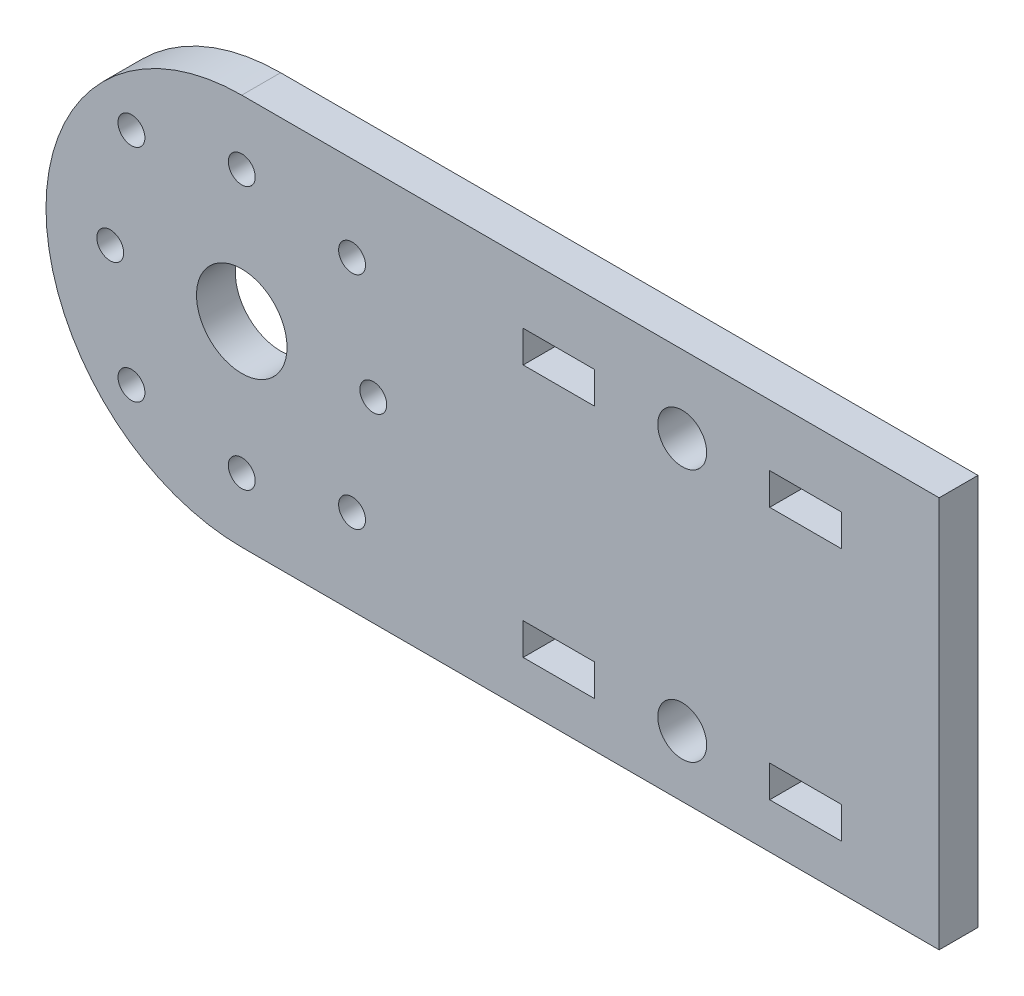
ISO-10303-21;
HEADER;
FILE_DESCRIPTION(('STEP AP214'),'2;1');
FILE_NAME('part.step','',(''),(''),'','','');
FILE_SCHEMA(('AUTOMOTIVE_DESIGN { 1 0 10303 214 1 1 1 1 }'));
ENDSEC;
DATA;
#1=APPLICATION_CONTEXT('core data for automotive mechanical design processes');
#2=APPLICATION_PROTOCOL_DEFINITION('international standard','automotive_design',2000,#1);
#3=PRODUCT_CONTEXT('',#1,'mechanical');
#4=PRODUCT('Part','Part','',(#3));
#5=PRODUCT_RELATED_PRODUCT_CATEGORY('part','',(#4));
#6=PRODUCT_DEFINITION_FORMATION('','',#4);
#7=PRODUCT_DEFINITION_CONTEXT('part definition',#1,'design');
#8=PRODUCT_DEFINITION('design','',#6,#7);
#9=PRODUCT_DEFINITION_SHAPE('','',#8);
#10=(LENGTH_UNIT() NAMED_UNIT(*) SI_UNIT(.MILLI.,.METRE.));
#11=(NAMED_UNIT(*) PLANE_ANGLE_UNIT() SI_UNIT($,.RADIAN.));
#12=(NAMED_UNIT(*) SI_UNIT($,.STERADIAN.) SOLID_ANGLE_UNIT());
#13=UNCERTAINTY_MEASURE_WITH_UNIT(LENGTH_MEASURE(1.E-05),#10,'distance_accuracy_value','');
#14=(GEOMETRIC_REPRESENTATION_CONTEXT(3) GLOBAL_UNCERTAINTY_ASSIGNED_CONTEXT((#13)) GLOBAL_UNIT_ASSIGNED_CONTEXT((#10,
#11,#12)) REPRESENTATION_CONTEXT('',''));
#15=CARTESIAN_POINT('',(0.,0.,0.));
#16=DIRECTION('',(0.,0.,1.));
#17=DIRECTION('',(1.,0.,0.));
#18=AXIS2_PLACEMENT_3D('',#15,#16,#17);
#19=CARTESIAN_POINT('',(19.,16.,3.175));
#20=DIRECTION('',(0.,0.,1.));
#21=DIRECTION('',(1.,0.,0.));
#22=AXIS2_PLACEMENT_3D('',#19,#20,#21);
#23=PLANE('',#22);
#24=DIRECTION('',(1.,0.,0.));
#25=VECTOR('',#24,1.);
#26=CARTESIAN_POINT('',(62.15,24.4,3.175));
#27=LINE('',#26,#25);
#28=CARTESIAN_POINT('',(62.15,24.4,3.175));
#29=VERTEX_POINT('',#28);
#30=CARTESIAN_POINT('',(68.,24.4,3.175));
#31=VERTEX_POINT('',#30);
#32=EDGE_CURVE('E178',#29,#31,#27,.T.);
#33=ORIENTED_EDGE('',*,*,#32,.F.);
#34=DIRECTION('',(0.,-1.,0.));
#35=VECTOR('',#34,1.);
#36=CARTESIAN_POINT('',(62.15,27.,3.175));
#37=LINE('',#36,#35);
#38=CARTESIAN_POINT('',(62.15,27.,3.175));
#39=VERTEX_POINT('',#38);
#40=EDGE_CURVE('E170',#39,#29,#37,.T.);
#41=ORIENTED_EDGE('',*,*,#40,.F.);
#42=DIRECTION('',(-1.,0.,0.));
#43=VECTOR('',#42,1.);
#44=CARTESIAN_POINT('',(62.15,27.,3.175));
#45=LINE('',#44,#43);
#46=CARTESIAN_POINT('',(68.,27.,3.175));
#47=VERTEX_POINT('',#46);
#48=EDGE_CURVE('E193',#47,#39,#45,.T.);
#49=ORIENTED_EDGE('',*,*,#48,.F.);
#50=DIRECTION('',(0.,1.,0.));
#51=VECTOR('',#50,1.);
#52=CARTESIAN_POINT('',(68.,27.,3.175));
#53=LINE('',#52,#51);
#54=EDGE_CURVE('E191',#31,#47,#53,.T.);
#55=ORIENTED_EDGE('',*,*,#54,.F.);
#56=EDGE_LOOP('',(#33,#41,#49,#55));
#57=FACE_BOUND('',#56,.T.);
#58=DIRECTION('',(-1.,0.,0.));
#59=VECTOR('',#58,1.);
#60=CARTESIAN_POINT('',(47.85,6.3,3.175));
#61=LINE('',#60,#59);
#62=CARTESIAN_POINT('',(47.85,6.3,3.175));
#63=VERTEX_POINT('',#62);
#64=CARTESIAN_POINT('',(42.,6.3,3.175));
#65=VERTEX_POINT('',#64);
#66=EDGE_CURVE('E242',#63,#65,#61,.T.);
#67=ORIENTED_EDGE('',*,*,#66,.F.);
#68=DIRECTION('',(0.,1.,0.));
#69=VECTOR('',#68,1.);
#70=CARTESIAN_POINT('',(47.85,6.3,3.175));
#71=LINE('',#70,#69);
#72=CARTESIAN_POINT('',(47.85,3.7,3.175));
#73=VERTEX_POINT('',#72);
#74=EDGE_CURVE('E240',#73,#63,#71,.T.);
#75=ORIENTED_EDGE('',*,*,#74,.F.);
#76=DIRECTION('',(1.,0.,0.));
#77=VECTOR('',#76,1.);
#78=CARTESIAN_POINT('',(47.85,3.7,3.175));
#79=LINE('',#78,#77);
#80=CARTESIAN_POINT('',(42.,3.7,3.175));
#81=VERTEX_POINT('',#80);
#82=EDGE_CURVE('E248',#81,#73,#79,.T.);
#83=ORIENTED_EDGE('',*,*,#82,.F.);
#84=DIRECTION('',(0.,-1.,0.));
#85=VECTOR('',#84,1.);
#86=CARTESIAN_POINT('',(42.,6.3,3.175));
#87=LINE('',#86,#85);
#88=EDGE_CURVE('E245',#65,#81,#87,.T.);
#89=ORIENTED_EDGE('',*,*,#88,.F.);
#90=EDGE_LOOP('',(#67,#75,#83,#89));
#91=FACE_BOUND('',#90,.T.);
#92=DIRECTION('',(1.,0.,0.));
#93=VECTOR('',#92,1.);
#94=CARTESIAN_POINT('',(42.,24.4,3.175));
#95=LINE('',#94,#93);
#96=CARTESIAN_POINT('',(42.,24.4,3.175));
#97=VERTEX_POINT('',#96);
#98=CARTESIAN_POINT('',(47.85,24.4,3.175));
#99=VERTEX_POINT('',#98);
#100=EDGE_CURVE('E279',#97,#99,#95,.T.);
#101=ORIENTED_EDGE('',*,*,#100,.F.);
#102=DIRECTION('',(0.,-1.,0.));
#103=VECTOR('',#102,1.);
#104=CARTESIAN_POINT('',(42.,27.,3.175));
#105=LINE('',#104,#103);
#106=CARTESIAN_POINT('',(42.,27.,3.175));
#107=VERTEX_POINT('',#106);
#108=EDGE_CURVE('E277',#107,#97,#105,.T.);
#109=ORIENTED_EDGE('',*,*,#108,.F.);
#110=DIRECTION('',(-1.,0.,0.));
#111=VECTOR('',#110,1.);
#112=CARTESIAN_POINT('',(42.,27.,3.175));
#113=LINE('',#112,#111);
#114=CARTESIAN_POINT('',(47.85,27.,3.175));
#115=VERTEX_POINT('',#114);
#116=EDGE_CURVE('E285',#115,#107,#113,.T.);
#117=ORIENTED_EDGE('',*,*,#116,.F.);
#118=DIRECTION('',(0.,1.,0.));
#119=VECTOR('',#118,1.);
#120=CARTESIAN_POINT('',(47.85,27.,3.175));
#121=LINE('',#120,#119);
#122=EDGE_CURVE('E282',#99,#115,#121,.T.);
#123=ORIENTED_EDGE('',*,*,#122,.F.);
#124=EDGE_LOOP('',(#101,#109,#117,#123));
#125=FACE_BOUND('',#124,.T.);
#126=CARTESIAN_POINT('',(29.75,16.,3.175));
#127=DIRECTION('',(0.,0.,1.));
#128=DIRECTION('',(1.,0.,0.));
#129=AXIS2_PLACEMENT_3D('',#126,#127,#128);
#130=CIRCLE('',#129,1.1);
#131=CARTESIAN_POINT('',(30.85,16.,3.175));
#132=VERTEX_POINT('',#131);
#133=EDGE_CURVE('E314',#132,#132,#130,.T.);
#134=ORIENTED_EDGE('',*,*,#133,.F.);
#135=EDGE_LOOP('',(#134));
#136=FACE_BOUND('',#135,.T.);
#137=CARTESIAN_POINT('',(9.98438853987172,6.98438853987153,3.175));
#138=DIRECTION('',(0.,0.,1.));
#139=DIRECTION('',(1.,0.,0.));
#140=AXIS2_PLACEMENT_3D('',#137,#138,#139);
#141=CIRCLE('',#140,1.1);
#142=CARTESIAN_POINT('',(11.0843885398717,6.98438853987153,3.175));
#143=VERTEX_POINT('',#142);
#144=EDGE_CURVE('E326',#143,#143,#141,.T.);
#145=ORIENTED_EDGE('',*,*,#144,.F.);
#146=EDGE_LOOP('',(#145));
#147=FACE_BOUND('',#146,.T.);
#148=CARTESIAN_POINT('',(28.0156114601285,25.0156114601287,3.175));
#149=DIRECTION('',(0.,0.,1.));
#150=DIRECTION('',(1.,0.,0.));
#151=AXIS2_PLACEMENT_3D('',#148,#149,#150);
#152=CIRCLE('',#151,1.1);
#153=CARTESIAN_POINT('',(29.1156114601285,25.0156114601287,3.175));
#154=VERTEX_POINT('',#153);
#155=EDGE_CURVE('E338',#154,#154,#152,.T.);
#156=ORIENTED_EDGE('',*,*,#155,.F.);
#157=EDGE_LOOP('',(#156));
#158=FACE_BOUND('',#157,.T.);
#159=CARTESIAN_POINT('',(9.98438853987153,25.0156114601285,3.175));
#160=DIRECTION('',(0.,0.,1.));
#161=DIRECTION('',(1.,0.,0.));
#162=AXIS2_PLACEMENT_3D('',#159,#160,#161);
#163=CIRCLE('',#162,1.1);
#164=CARTESIAN_POINT('',(11.0843885398715,25.0156114601285,3.175));
#165=VERTEX_POINT('',#164);
#166=EDGE_CURVE('E350',#165,#165,#163,.T.);
#167=ORIENTED_EDGE('',*,*,#166,.F.);
#168=EDGE_LOOP('',(#167));
#169=FACE_BOUND('',#168,.T.);
#170=DIRECTION('',(0.,1.,0.));
#171=VECTOR('',#170,1.);
#172=CARTESIAN_POINT('',(76.,0.,3.175));
#173=LINE('',#172,#171);
#174=CARTESIAN_POINT('',(76.,0.,3.175));
#175=VERTEX_POINT('',#174);
#176=CARTESIAN_POINT('',(76.,32.,3.175));
#177=VERTEX_POINT('',#176);
#178=EDGE_CURVE('E362',#175,#177,#173,.T.);
#179=ORIENTED_EDGE('',*,*,#178,.T.);
#180=DIRECTION('',(-1.,0.,0.));
#181=VECTOR('',#180,1.);
#182=CARTESIAN_POINT('',(19.,32.,3.175));
#183=LINE('',#182,#181);
#184=CARTESIAN_POINT('',(19.,32.,3.175));
#185=VERTEX_POINT('',#184);
#186=EDGE_CURVE('E365',#177,#185,#183,.T.);
#187=ORIENTED_EDGE('',*,*,#186,.T.);
#188=CARTESIAN_POINT('',(19.,16.,3.175));
#189=DIRECTION('',(0.,0.,1.));
#190=DIRECTION('',(1.,0.,0.));
#191=AXIS2_PLACEMENT_3D('',#188,#189,#190);
#192=CIRCLE('',#191,16.);
#193=CARTESIAN_POINT('',(19.,0.,3.175));
#194=VERTEX_POINT('',#193);
#195=EDGE_CURVE('E368',#185,#194,#192,.T.);
#196=ORIENTED_EDGE('',*,*,#195,.T.);
#197=DIRECTION('',(1.,0.,0.));
#198=VECTOR('',#197,1.);
#199=CARTESIAN_POINT('',(19.,0.,3.175));
#200=LINE('',#199,#198);
#201=EDGE_CURVE('E370',#194,#175,#200,.T.);
#202=ORIENTED_EDGE('',*,*,#201,.T.);
#203=EDGE_LOOP('',(#179,#187,#196,#202));
#204=FACE_BOUND('',#203,.T.);
#205=CARTESIAN_POINT('',(8.25,16.,3.175));
#206=DIRECTION('',(0.,0.,1.));
#207=DIRECTION('',(1.,0.,0.));
#208=AXIS2_PLACEMENT_3D('',#205,#206,#207);
#209=CIRCLE('',#208,1.1);
#210=CARTESIAN_POINT('',(9.35,16.,3.175));
#211=VERTEX_POINT('',#210);
#212=EDGE_CURVE('E356',#211,#211,#209,.T.);
#213=ORIENTED_EDGE('',*,*,#212,.F.);
#214=EDGE_LOOP('',(#213));
#215=FACE_BOUND('',#214,.T.);
#216=CARTESIAN_POINT('',(19.,16.,3.175));
#217=DIRECTION('',(0.,0.,1.));
#218=DIRECTION('',(1.,0.,0.));
#219=AXIS2_PLACEMENT_3D('',#216,#217,#218);
#220=CIRCLE('',#219,3.7);
#221=CARTESIAN_POINT('',(22.7,16.,3.175));
#222=VERTEX_POINT('',#221);
#223=EDGE_CURVE('E344',#222,#222,#220,.T.);
#224=ORIENTED_EDGE('',*,*,#223,.F.);
#225=EDGE_LOOP('',(#224));
#226=FACE_BOUND('',#225,.T.);
#227=CARTESIAN_POINT('',(28.0156114601287,6.98438853987172,3.175));
#228=DIRECTION('',(0.,0.,1.));
#229=DIRECTION('',(1.,0.,0.));
#230=AXIS2_PLACEMENT_3D('',#227,#228,#229);
#231=CIRCLE('',#230,1.1);
#232=CARTESIAN_POINT('',(29.1156114601287,6.98438853987172,3.175));
#233=VERTEX_POINT('',#232);
#234=EDGE_CURVE('E332',#233,#233,#231,.T.);
#235=ORIENTED_EDGE('',*,*,#234,.F.);
#236=EDGE_LOOP('',(#235));
#237=FACE_BOUND('',#236,.T.);
#238=CARTESIAN_POINT('',(19.,26.75,3.175));
#239=DIRECTION('',(0.,0.,1.));
#240=DIRECTION('',(1.,0.,0.));
#241=AXIS2_PLACEMENT_3D('',#238,#239,#240);
#242=CIRCLE('',#241,1.1);
#243=CARTESIAN_POINT('',(20.1,26.75,3.175));
#244=VERTEX_POINT('',#243);
#245=EDGE_CURVE('E320',#244,#244,#242,.T.);
#246=ORIENTED_EDGE('',*,*,#245,.F.);
#247=EDGE_LOOP('',(#246));
#248=FACE_BOUND('',#247,.T.);
#249=CARTESIAN_POINT('',(19.,5.25,3.175));
#250=DIRECTION('',(0.,0.,1.));
#251=DIRECTION('',(1.,0.,0.));
#252=AXIS2_PLACEMENT_3D('',#249,#250,#251);
#253=CIRCLE('',#252,1.1);
#254=CARTESIAN_POINT('',(20.1,5.25,3.175));
#255=VERTEX_POINT('',#254);
#256=EDGE_CURVE('E308',#255,#255,#253,.T.);
#257=ORIENTED_EDGE('',*,*,#256,.F.);
#258=EDGE_LOOP('',(#257));
#259=FACE_BOUND('',#258,.T.);
#260=CARTESIAN_POINT('',(55.,5.,3.175));
#261=DIRECTION('',(0.,0.,1.));
#262=DIRECTION('',(1.,0.,0.));
#263=AXIS2_PLACEMENT_3D('',#260,#261,#262);
#264=CIRCLE('',#263,2.);
#265=CARTESIAN_POINT('',(57.,5.,3.175));
#266=VERTEX_POINT('',#265);
#267=EDGE_CURVE('E271',#266,#266,#264,.T.);
#268=ORIENTED_EDGE('',*,*,#267,.F.);
#269=EDGE_LOOP('',(#268));
#270=FACE_BOUND('',#269,.T.);
#271=DIRECTION('',(1.,0.,0.));
#272=VECTOR('',#271,1.);
#273=CARTESIAN_POINT('',(62.15,3.7,3.175));
#274=LINE('',#273,#272);
#275=CARTESIAN_POINT('',(62.15,3.7,3.175));
#276=VERTEX_POINT('',#275);
#277=CARTESIAN_POINT('',(68.,3.7,3.175));
#278=VERTEX_POINT('',#277);
#279=EDGE_CURVE('E211',#276,#278,#274,.T.);
#280=ORIENTED_EDGE('',*,*,#279,.F.);
#281=DIRECTION('',(0.,-1.,0.));
#282=VECTOR('',#281,1.);
#283=CARTESIAN_POINT('',(62.15,6.3,3.175));
#284=LINE('',#283,#282);
#285=CARTESIAN_POINT('',(62.15,6.3,3.175));
#286=VERTEX_POINT('',#285);
#287=EDGE_CURVE('E209',#286,#276,#284,.T.);
#288=ORIENTED_EDGE('',*,*,#287,.F.);
#289=DIRECTION('',(-1.,0.,0.));
#290=VECTOR('',#289,1.);
#291=CARTESIAN_POINT('',(62.15,6.3,3.175));
#292=LINE('',#291,#290);
#293=CARTESIAN_POINT('',(68.,6.3,3.175));
#294=VERTEX_POINT('',#293);
#295=EDGE_CURVE('E217',#294,#286,#292,.T.);
#296=ORIENTED_EDGE('',*,*,#295,.F.);
#297=DIRECTION('',(0.,1.,0.));
#298=VECTOR('',#297,1.);
#299=CARTESIAN_POINT('',(68.,6.3,3.175));
#300=LINE('',#299,#298);
#301=EDGE_CURVE('E214',#278,#294,#300,.T.);
#302=ORIENTED_EDGE('',*,*,#301,.F.);
#303=EDGE_LOOP('',(#280,#288,#296,#302));
#304=FACE_BOUND('',#303,.T.);
#305=CARTESIAN_POINT('',(55.,25.7,3.175));
#306=DIRECTION('',(0.,0.,1.));
#307=DIRECTION('',(1.,0.,0.));
#308=AXIS2_PLACEMENT_3D('',#305,#306,#307);
#309=CIRCLE('',#308,2.);
#310=CARTESIAN_POINT('',(57.,25.7,3.175));
#311=VERTEX_POINT('',#310);
#312=EDGE_CURVE('E199',#311,#311,#309,.T.);
#313=ORIENTED_EDGE('',*,*,#312,.F.);
#314=EDGE_LOOP('',(#313));
#315=FACE_BOUND('',#314,.T.);
#316=ADVANCED_FACE('F33',(#57,#91,#125,#136,#147,#158,#169,#204,#215,#226,#237,#248,#259,#270,
#304,#315),#23,.T.);
#317=CARTESIAN_POINT('',(19.,16.,0.));
#318=DIRECTION('',(0.,0.,1.));
#319=DIRECTION('',(1.,0.,0.));
#320=AXIS2_PLACEMENT_3D('',#317,#318,#319);
#321=PLANE('',#320);
#322=DIRECTION('',(0.,-1.,0.));
#323=VECTOR('',#322,1.);
#324=CARTESIAN_POINT('',(62.15,27.,0.));
#325=LINE('',#324,#323);
#326=CARTESIAN_POINT('',(62.15,27.,0.));
#327=VERTEX_POINT('',#326);
#328=CARTESIAN_POINT('',(62.15,24.4,0.));
#329=VERTEX_POINT('',#328);
#330=EDGE_CURVE('E56',#327,#329,#325,.T.);
#331=ORIENTED_EDGE('',*,*,#330,.T.);
#332=DIRECTION('',(1.,0.,0.));
#333=VECTOR('',#332,1.);
#334=CARTESIAN_POINT('',(62.15,24.4,0.));
#335=LINE('',#334,#333);
#336=CARTESIAN_POINT('',(68.,24.4,0.));
#337=VERTEX_POINT('',#336);
#338=EDGE_CURVE('E185',#329,#337,#335,.T.);
#339=ORIENTED_EDGE('',*,*,#338,.T.);
#340=DIRECTION('',(0.,1.,0.));
#341=VECTOR('',#340,1.);
#342=CARTESIAN_POINT('',(68.,27.,0.));
#343=LINE('',#342,#341);
#344=CARTESIAN_POINT('',(68.,27.,0.));
#345=VERTEX_POINT('',#344);
#346=EDGE_CURVE('E201',#337,#345,#343,.T.);
#347=ORIENTED_EDGE('',*,*,#346,.T.);
#348=DIRECTION('',(-1.,0.,0.));
#349=VECTOR('',#348,1.);
#350=CARTESIAN_POINT('',(62.15,27.,0.));
#351=LINE('',#350,#349);
#352=EDGE_CURVE('E179',#345,#327,#351,.T.);
#353=ORIENTED_EDGE('',*,*,#352,.T.);
#354=EDGE_LOOP('',(#331,#339,#347,#353));
#355=FACE_BOUND('',#354,.T.);
#356=DIRECTION('',(0.,1.,0.));
#357=VECTOR('',#356,1.);
#358=CARTESIAN_POINT('',(47.85,6.3,0.));
#359=LINE('',#358,#357);
#360=CARTESIAN_POINT('',(47.85,3.7,0.));
#361=VERTEX_POINT('',#360);
#362=CARTESIAN_POINT('',(47.85,6.3,0.));
#363=VERTEX_POINT('',#362);
#364=EDGE_CURVE('E239',#361,#363,#359,.T.);
#365=ORIENTED_EDGE('',*,*,#364,.T.);
#366=DIRECTION('',(-1.,0.,0.));
#367=VECTOR('',#366,1.);
#368=CARTESIAN_POINT('',(47.85,6.3,0.));
#369=LINE('',#368,#367);
#370=CARTESIAN_POINT('',(42.,6.3,0.));
#371=VERTEX_POINT('',#370);
#372=EDGE_CURVE('E253',#363,#371,#369,.T.);
#373=ORIENTED_EDGE('',*,*,#372,.T.);
#374=DIRECTION('',(0.,-1.,0.));
#375=VECTOR('',#374,1.);
#376=CARTESIAN_POINT('',(42.,6.3,0.));
#377=LINE('',#376,#375);
#378=CARTESIAN_POINT('',(42.,3.7,0.));
#379=VERTEX_POINT('',#378);
#380=EDGE_CURVE('E256',#371,#379,#377,.T.);
#381=ORIENTED_EDGE('',*,*,#380,.T.);
#382=DIRECTION('',(1.,0.,0.));
#383=VECTOR('',#382,1.);
#384=CARTESIAN_POINT('',(47.85,3.7,0.));
#385=LINE('',#384,#383);
#386=EDGE_CURVE('E243',#379,#361,#385,.T.);
#387=ORIENTED_EDGE('',*,*,#386,.T.);
#388=EDGE_LOOP('',(#365,#373,#381,#387));
#389=FACE_BOUND('',#388,.T.);
#390=DIRECTION('',(0.,-1.,0.));
#391=VECTOR('',#390,1.);
#392=CARTESIAN_POINT('',(42.,27.,0.));
#393=LINE('',#392,#391);
#394=CARTESIAN_POINT('',(42.,27.,0.));
#395=VERTEX_POINT('',#394);
#396=CARTESIAN_POINT('',(42.,24.4,0.));
#397=VERTEX_POINT('',#396);
#398=EDGE_CURVE('E274',#395,#397,#393,.T.);
#399=ORIENTED_EDGE('',*,*,#398,.T.);
#400=DIRECTION('',(1.,0.,0.));
#401=VECTOR('',#400,1.);
#402=CARTESIAN_POINT('',(42.,24.4,0.));
#403=LINE('',#402,#401);
#404=CARTESIAN_POINT('',(47.85,24.4,0.));
#405=VERTEX_POINT('',#404);
#406=EDGE_CURVE('E290',#397,#405,#403,.T.);
#407=ORIENTED_EDGE('',*,*,#406,.T.);
#408=DIRECTION('',(0.,1.,0.));
#409=VECTOR('',#408,1.);
#410=CARTESIAN_POINT('',(47.85,27.,0.));
#411=LINE('',#410,#409);
#412=CARTESIAN_POINT('',(47.85,27.,0.));
#413=VERTEX_POINT('',#412);
#414=EDGE_CURVE('E293',#405,#413,#411,.T.);
#415=ORIENTED_EDGE('',*,*,#414,.T.);
#416=DIRECTION('',(-1.,0.,0.));
#417=VECTOR('',#416,1.);
#418=CARTESIAN_POINT('',(42.,27.,0.));
#419=LINE('',#418,#417);
#420=EDGE_CURVE('E280',#413,#395,#419,.T.);
#421=ORIENTED_EDGE('',*,*,#420,.T.);
#422=EDGE_LOOP('',(#399,#407,#415,#421));
#423=FACE_BOUND('',#422,.T.);
#424=CARTESIAN_POINT('',(29.75,16.,0.));
#425=DIRECTION('',(0.,0.,1.));
#426=DIRECTION('',(1.,0.,0.));
#427=AXIS2_PLACEMENT_3D('',#424,#425,#426);
#428=CIRCLE('',#427,1.1);
#429=CARTESIAN_POINT('',(30.85,16.,0.));
#430=VERTEX_POINT('',#429);
#431=EDGE_CURVE('E311',#430,#430,#428,.T.);
#432=ORIENTED_EDGE('',*,*,#431,.T.);
#433=EDGE_LOOP('',(#432));
#434=FACE_BOUND('',#433,.T.);
#435=CARTESIAN_POINT('',(9.98438853987172,6.98438853987153,0.));
#436=DIRECTION('',(0.,0.,1.));
#437=DIRECTION('',(1.,0.,0.));
#438=AXIS2_PLACEMENT_3D('',#435,#436,#437);
#439=CIRCLE('',#438,1.1);
#440=CARTESIAN_POINT('',(11.0843885398717,6.98438853987153,0.));
#441=VERTEX_POINT('',#440);
#442=EDGE_CURVE('E323',#441,#441,#439,.T.);
#443=ORIENTED_EDGE('',*,*,#442,.T.);
#444=EDGE_LOOP('',(#443));
#445=FACE_BOUND('',#444,.T.);
#446=CARTESIAN_POINT('',(28.0156114601285,25.0156114601287,0.));
#447=DIRECTION('',(0.,0.,1.));
#448=DIRECTION('',(1.,0.,0.));
#449=AXIS2_PLACEMENT_3D('',#446,#447,#448);
#450=CIRCLE('',#449,1.1);
#451=CARTESIAN_POINT('',(29.1156114601285,25.0156114601287,0.));
#452=VERTEX_POINT('',#451);
#453=EDGE_CURVE('E335',#452,#452,#450,.T.);
#454=ORIENTED_EDGE('',*,*,#453,.T.);
#455=EDGE_LOOP('',(#454));
#456=FACE_BOUND('',#455,.T.);
#457=CARTESIAN_POINT('',(9.98438853987153,25.0156114601285,0.));
#458=DIRECTION('',(0.,0.,1.));
#459=DIRECTION('',(1.,0.,0.));
#460=AXIS2_PLACEMENT_3D('',#457,#458,#459);
#461=CIRCLE('',#460,1.1);
#462=CARTESIAN_POINT('',(11.0843885398715,25.0156114601285,0.));
#463=VERTEX_POINT('',#462);
#464=EDGE_CURVE('E347',#463,#463,#461,.T.);
#465=ORIENTED_EDGE('',*,*,#464,.T.);
#466=EDGE_LOOP('',(#465));
#467=FACE_BOUND('',#466,.T.);
#468=DIRECTION('',(0.,1.,0.));
#469=VECTOR('',#468,1.);
#470=CARTESIAN_POINT('',(76.,0.,0.));
#471=LINE('',#470,#469);
#472=CARTESIAN_POINT('',(76.,0.,0.));
#473=VERTEX_POINT('',#472);
#474=CARTESIAN_POINT('',(76.,32.,0.));
#475=VERTEX_POINT('',#474);
#476=EDGE_CURVE('E359',#473,#475,#471,.T.);
#477=ORIENTED_EDGE('',*,*,#476,.F.);
#478=DIRECTION('',(1.,0.,0.));
#479=VECTOR('',#478,1.);
#480=CARTESIAN_POINT('',(19.,0.,0.));
#481=LINE('',#480,#479);
#482=CARTESIAN_POINT('',(19.,0.,0.));
#483=VERTEX_POINT('',#482);
#484=EDGE_CURVE('E366',#483,#473,#481,.T.);
#485=ORIENTED_EDGE('',*,*,#484,.F.);
#486=CARTESIAN_POINT('',(19.,16.,0.));
#487=DIRECTION('',(0.,0.,1.));
#488=DIRECTION('',(1.,0.,0.));
#489=AXIS2_PLACEMENT_3D('',#486,#487,#488);
#490=CIRCLE('',#489,16.);
#491=CARTESIAN_POINT('',(19.,32.,0.));
#492=VERTEX_POINT('',#491);
#493=EDGE_CURVE('E377',#492,#483,#490,.T.);
#494=ORIENTED_EDGE('',*,*,#493,.F.);
#495=DIRECTION('',(-1.,0.,0.));
#496=VECTOR('',#495,1.);
#497=CARTESIAN_POINT('',(19.,32.,0.));
#498=LINE('',#497,#496);
#499=EDGE_CURVE('E375',#475,#492,#498,.T.);
#500=ORIENTED_EDGE('',*,*,#499,.F.);
#501=EDGE_LOOP('',(#477,#485,#494,#500));
#502=FACE_BOUND('',#501,.T.);
#503=CARTESIAN_POINT('',(8.25,16.,0.));
#504=DIRECTION('',(0.,0.,1.));
#505=DIRECTION('',(1.,0.,0.));
#506=AXIS2_PLACEMENT_3D('',#503,#504,#505);
#507=CIRCLE('',#506,1.1);
#508=CARTESIAN_POINT('',(9.35,16.,0.));
#509=VERTEX_POINT('',#508);
#510=EDGE_CURVE('E353',#509,#509,#507,.T.);
#511=ORIENTED_EDGE('',*,*,#510,.T.);
#512=EDGE_LOOP('',(#511));
#513=FACE_BOUND('',#512,.T.);
#514=CARTESIAN_POINT('',(19.,16.,0.));
#515=DIRECTION('',(0.,0.,1.));
#516=DIRECTION('',(1.,0.,0.));
#517=AXIS2_PLACEMENT_3D('',#514,#515,#516);
#518=CIRCLE('',#517,3.7);
#519=CARTESIAN_POINT('',(22.7,16.,0.));
#520=VERTEX_POINT('',#519);
#521=EDGE_CURVE('E341',#520,#520,#518,.T.);
#522=ORIENTED_EDGE('',*,*,#521,.T.);
#523=EDGE_LOOP('',(#522));
#524=FACE_BOUND('',#523,.T.);
#525=CARTESIAN_POINT('',(28.0156114601287,6.98438853987172,0.));
#526=DIRECTION('',(0.,0.,1.));
#527=DIRECTION('',(1.,0.,0.));
#528=AXIS2_PLACEMENT_3D('',#525,#526,#527);
#529=CIRCLE('',#528,1.1);
#530=CARTESIAN_POINT('',(29.1156114601287,6.98438853987172,0.));
#531=VERTEX_POINT('',#530);
#532=EDGE_CURVE('E329',#531,#531,#529,.T.);
#533=ORIENTED_EDGE('',*,*,#532,.T.);
#534=EDGE_LOOP('',(#533));
#535=FACE_BOUND('',#534,.T.);
#536=CARTESIAN_POINT('',(19.,26.75,0.));
#537=DIRECTION('',(0.,0.,1.));
#538=DIRECTION('',(1.,0.,0.));
#539=AXIS2_PLACEMENT_3D('',#536,#537,#538);
#540=CIRCLE('',#539,1.1);
#541=CARTESIAN_POINT('',(20.1,26.75,0.));
#542=VERTEX_POINT('',#541);
#543=EDGE_CURVE('E317',#542,#542,#540,.T.);
#544=ORIENTED_EDGE('',*,*,#543,.T.);
#545=EDGE_LOOP('',(#544));
#546=FACE_BOUND('',#545,.T.);
#547=CARTESIAN_POINT('',(19.,5.25,0.));
#548=DIRECTION('',(0.,0.,1.));
#549=DIRECTION('',(1.,0.,0.));
#550=AXIS2_PLACEMENT_3D('',#547,#548,#549);
#551=CIRCLE('',#550,1.1);
#552=CARTESIAN_POINT('',(20.1,5.25,0.));
#553=VERTEX_POINT('',#552);
#554=EDGE_CURVE('E307',#553,#553,#551,.T.);
#555=ORIENTED_EDGE('',*,*,#554,.T.);
#556=EDGE_LOOP('',(#555));
#557=FACE_BOUND('',#556,.T.);
#558=CARTESIAN_POINT('',(55.,5.,0.));
#559=DIRECTION('',(0.,0.,1.));
#560=DIRECTION('',(1.,0.,0.));
#561=AXIS2_PLACEMENT_3D('',#558,#559,#560);
#562=CIRCLE('',#561,2.);
#563=CARTESIAN_POINT('',(57.,5.,0.));
#564=VERTEX_POINT('',#563);
#565=EDGE_CURVE('E270',#564,#564,#562,.T.);
#566=ORIENTED_EDGE('',*,*,#565,.T.);
#567=EDGE_LOOP('',(#566));
#568=FACE_BOUND('',#567,.T.);
#569=DIRECTION('',(0.,-1.,0.));
#570=VECTOR('',#569,1.);
#571=CARTESIAN_POINT('',(62.15,6.3,0.));
#572=LINE('',#571,#570);
#573=CARTESIAN_POINT('',(62.15,6.3,0.));
#574=VERTEX_POINT('',#573);
#575=CARTESIAN_POINT('',(62.15,3.7,0.));
#576=VERTEX_POINT('',#575);
#577=EDGE_CURVE('E186',#574,#576,#572,.T.);
#578=ORIENTED_EDGE('',*,*,#577,.T.);
#579=DIRECTION('',(1.,0.,0.));
#580=VECTOR('',#579,1.);
#581=CARTESIAN_POINT('',(62.15,3.7,0.));
#582=LINE('',#581,#580);
#583=CARTESIAN_POINT('',(68.,3.7,0.));
#584=VERTEX_POINT('',#583);
#585=EDGE_CURVE('E222',#576,#584,#582,.T.);
#586=ORIENTED_EDGE('',*,*,#585,.T.);
#587=DIRECTION('',(0.,1.,0.));
#588=VECTOR('',#587,1.);
#589=CARTESIAN_POINT('',(68.,6.3,0.));
#590=LINE('',#589,#588);
#591=CARTESIAN_POINT('',(68.,6.3,0.));
#592=VERTEX_POINT('',#591);
#593=EDGE_CURVE('E225',#584,#592,#590,.T.);
#594=ORIENTED_EDGE('',*,*,#593,.T.);
#595=DIRECTION('',(-1.,0.,0.));
#596=VECTOR('',#595,1.);
#597=CARTESIAN_POINT('',(62.15,6.3,0.));
#598=LINE('',#597,#596);
#599=EDGE_CURVE('E212',#592,#574,#598,.T.);
#600=ORIENTED_EDGE('',*,*,#599,.T.);
#601=EDGE_LOOP('',(#578,#586,#594,#600));
#602=FACE_BOUND('',#601,.T.);
#603=CARTESIAN_POINT('',(55.,25.7,0.));
#604=DIRECTION('',(0.,0.,1.));
#605=DIRECTION('',(1.,0.,0.));
#606=AXIS2_PLACEMENT_3D('',#603,#604,#605);
#607=CIRCLE('',#606,2.);
#608=CARTESIAN_POINT('',(57.,25.7,0.));
#609=VERTEX_POINT('',#608);
#610=EDGE_CURVE('E452',#609,#609,#607,.T.);
#611=ORIENTED_EDGE('',*,*,#610,.T.);
#612=EDGE_LOOP('',(#611));
#613=FACE_BOUND('',#612,.T.);
#614=ADVANCED_FACE('F395',(#355,#389,#423,#434,#445,#456,#467,#502,#513,#524,#535,#546,#557,
#568,#602,#613),#321,.F.);
#615=CARTESIAN_POINT('',(76.,0.,3.175));
#616=DIRECTION('',(-1.,0.,0.));
#617=DIRECTION('',(0.,-1.,0.));
#618=AXIS2_PLACEMENT_3D('',#615,#616,#617);
#619=PLANE('',#618);
#620=ORIENTED_EDGE('',*,*,#476,.T.);
#621=DIRECTION('',(0.,0.,-1.));
#622=VECTOR('',#621,1.);
#623=CARTESIAN_POINT('',(76.,32.,3.175));
#624=LINE('',#623,#622);
#625=EDGE_CURVE('E11',#177,#475,#624,.T.);
#626=ORIENTED_EDGE('',*,*,#625,.F.);
#627=ORIENTED_EDGE('',*,*,#178,.F.);
#628=DIRECTION('',(0.,0.,-1.));
#629=VECTOR('',#628,1.);
#630=CARTESIAN_POINT('',(76.,0.,3.175));
#631=LINE('',#630,#629);
#632=EDGE_CURVE('E372',#175,#473,#631,.T.);
#633=ORIENTED_EDGE('',*,*,#632,.T.);
#634=EDGE_LOOP('',(#620,#626,#627,#633));
#635=FACE_BOUND('',#634,.T.);
#636=ADVANCED_FACE('F35',(#635),#619,.F.);
#637=CARTESIAN_POINT('',(19.,32.,3.175));
#638=DIRECTION('',(0.,-1.,0.));
#639=DIRECTION('',(0.,0.,-1.));
#640=AXIS2_PLACEMENT_3D('',#637,#638,#639);
#641=PLANE('',#640);
#642=ORIENTED_EDGE('',*,*,#499,.T.);
#643=DIRECTION('',(0.,0.,-1.));
#644=VECTOR('',#643,1.);
#645=CARTESIAN_POINT('',(19.,32.,3.175));
#646=LINE('',#645,#644);
#647=EDGE_CURVE('E41',#185,#492,#646,.T.);
#648=ORIENTED_EDGE('',*,*,#647,.F.);
#649=ORIENTED_EDGE('',*,*,#186,.F.);
#650=ORIENTED_EDGE('',*,*,#625,.T.);
#651=EDGE_LOOP('',(#642,#648,#649,#650));
#652=FACE_BOUND('',#651,.T.);
#653=ADVANCED_FACE('F406',(#652),#641,.F.);
#654=CARTESIAN_POINT('',(19.,16.,3.175));
#655=DIRECTION('',(0.,0.,-1.));
#656=DIRECTION('',(-1.,0.,0.));
#657=AXIS2_PLACEMENT_3D('',#654,#655,#656);
#658=CYLINDRICAL_SURFACE('',#657,16.);
#659=ORIENTED_EDGE('',*,*,#493,.T.);
#660=DIRECTION('',(0.,0.,-1.));
#661=VECTOR('',#660,1.);
#662=CARTESIAN_POINT('',(19.,0.,3.175));
#663=LINE('',#662,#661);
#664=EDGE_CURVE('E382',#194,#483,#663,.T.);
#665=ORIENTED_EDGE('',*,*,#664,.F.);
#666=ORIENTED_EDGE('',*,*,#195,.F.);
#667=ORIENTED_EDGE('',*,*,#647,.T.);
#668=EDGE_LOOP('',(#659,#665,#666,#667));
#669=FACE_BOUND('',#668,.T.);
#670=ADVANCED_FACE('F389',(#669),#658,.T.);
#671=CARTESIAN_POINT('',(19.,0.,3.175));
#672=DIRECTION('',(0.,1.,0.));
#673=DIRECTION('',(0.,0.,1.));
#674=AXIS2_PLACEMENT_3D('',#671,#672,#673);
#675=PLANE('',#674);
#676=ORIENTED_EDGE('',*,*,#484,.T.);
#677=ORIENTED_EDGE('',*,*,#632,.F.);
#678=ORIENTED_EDGE('',*,*,#201,.F.);
#679=ORIENTED_EDGE('',*,*,#664,.T.);
#680=EDGE_LOOP('',(#676,#677,#678,#679));
#681=FACE_BOUND('',#680,.T.);
#682=ADVANCED_FACE('F399',(#681),#675,.F.);
#683=CARTESIAN_POINT('',(8.25,16.,3.175));
#684=DIRECTION('',(0.,0.,-1.));
#685=DIRECTION('',(-1.,0.,0.));
#686=AXIS2_PLACEMENT_3D('',#683,#684,#685);
#687=CYLINDRICAL_SURFACE('',#686,1.1);
#688=ORIENTED_EDGE('',*,*,#212,.T.);
#689=EDGE_LOOP('',(#688));
#690=FACE_BOUND('',#689,.T.);
#691=ORIENTED_EDGE('',*,*,#510,.F.);
#692=EDGE_LOOP('',(#691));
#693=FACE_BOUND('',#692,.T.);
#694=ADVANCED_FACE('F421',(#690,#693),#687,.F.);
#695=CARTESIAN_POINT('',(9.98438853987153,25.0156114601285,3.175));
#696=DIRECTION('',(0.,0.,-1.));
#697=DIRECTION('',(-1.,0.,0.));
#698=AXIS2_PLACEMENT_3D('',#695,#696,#697);
#699=CYLINDRICAL_SURFACE('',#698,1.1);
#700=ORIENTED_EDGE('',*,*,#166,.T.);
#701=EDGE_LOOP('',(#700));
#702=FACE_BOUND('',#701,.T.);
#703=ORIENTED_EDGE('',*,*,#464,.F.);
#704=EDGE_LOOP('',(#703));
#705=FACE_BOUND('',#704,.T.);
#706=ADVANCED_FACE('F428',(#702,#705),#699,.F.);
#707=CARTESIAN_POINT('',(19.,16.,3.175));
#708=DIRECTION('',(0.,0.,-1.));
#709=DIRECTION('',(-1.,0.,0.));
#710=AXIS2_PLACEMENT_3D('',#707,#708,#709);
#711=CYLINDRICAL_SURFACE('',#710,3.7);
#712=ORIENTED_EDGE('',*,*,#223,.T.);
#713=EDGE_LOOP('',(#712));
#714=FACE_BOUND('',#713,.T.);
#715=ORIENTED_EDGE('',*,*,#521,.F.);
#716=EDGE_LOOP('',(#715));
#717=FACE_BOUND('',#716,.T.);
#718=ADVANCED_FACE('F433',(#714,#717),#711,.F.);
#719=CARTESIAN_POINT('',(28.0156114601285,25.0156114601287,3.175));
#720=DIRECTION('',(0.,0.,-1.));
#721=DIRECTION('',(-1.,0.,0.));
#722=AXIS2_PLACEMENT_3D('',#719,#720,#721);
#723=CYLINDRICAL_SURFACE('',#722,1.1);
#724=ORIENTED_EDGE('',*,*,#155,.T.);
#725=EDGE_LOOP('',(#724));
#726=FACE_BOUND('',#725,.T.);
#727=ORIENTED_EDGE('',*,*,#453,.F.);
#728=EDGE_LOOP('',(#727));
#729=FACE_BOUND('',#728,.T.);
#730=ADVANCED_FACE('F547',(#726,#729),#723,.F.);
#731=CARTESIAN_POINT('',(28.0156114601287,6.98438853987172,3.175));
#732=DIRECTION('',(0.,0.,-1.));
#733=DIRECTION('',(-1.,0.,0.));
#734=AXIS2_PLACEMENT_3D('',#731,#732,#733);
#735=CYLINDRICAL_SURFACE('',#734,1.1);
#736=ORIENTED_EDGE('',*,*,#234,.T.);
#737=EDGE_LOOP('',(#736));
#738=FACE_BOUND('',#737,.T.);
#739=ORIENTED_EDGE('',*,*,#532,.F.);
#740=EDGE_LOOP('',(#739));
#741=FACE_BOUND('',#740,.T.);
#742=ADVANCED_FACE('F543',(#738,#741),#735,.F.);
#743=CARTESIAN_POINT('',(9.98438853987172,6.98438853987153,3.175));
#744=DIRECTION('',(0.,0.,-1.));
#745=DIRECTION('',(-1.,0.,0.));
#746=AXIS2_PLACEMENT_3D('',#743,#744,#745);
#747=CYLINDRICAL_SURFACE('',#746,1.1);
#748=ORIENTED_EDGE('',*,*,#144,.T.);
#749=EDGE_LOOP('',(#748));
#750=FACE_BOUND('',#749,.T.);
#751=ORIENTED_EDGE('',*,*,#442,.F.);
#752=EDGE_LOOP('',(#751));
#753=FACE_BOUND('',#752,.T.);
#754=ADVANCED_FACE('F539',(#750,#753),#747,.F.);
#755=CARTESIAN_POINT('',(19.,26.75,3.175));
#756=DIRECTION('',(0.,0.,-1.));
#757=DIRECTION('',(-1.,0.,0.));
#758=AXIS2_PLACEMENT_3D('',#755,#756,#757);
#759=CYLINDRICAL_SURFACE('',#758,1.1);
#760=ORIENTED_EDGE('',*,*,#245,.T.);
#761=EDGE_LOOP('',(#760));
#762=FACE_BOUND('',#761,.T.);
#763=ORIENTED_EDGE('',*,*,#543,.F.);
#764=EDGE_LOOP('',(#763));
#765=FACE_BOUND('',#764,.T.);
#766=ADVANCED_FACE('F535',(#762,#765),#759,.F.);
#767=CARTESIAN_POINT('',(29.75,16.,3.175));
#768=DIRECTION('',(0.,0.,-1.));
#769=DIRECTION('',(-1.,0.,0.));
#770=AXIS2_PLACEMENT_3D('',#767,#768,#769);
#771=CYLINDRICAL_SURFACE('',#770,1.1);
#772=ORIENTED_EDGE('',*,*,#133,.T.);
#773=EDGE_LOOP('',(#772));
#774=FACE_BOUND('',#773,.T.);
#775=ORIENTED_EDGE('',*,*,#431,.F.);
#776=EDGE_LOOP('',(#775));
#777=FACE_BOUND('',#776,.T.);
#778=ADVANCED_FACE('F531',(#774,#777),#771,.F.);
#779=CARTESIAN_POINT('',(19.,5.25,3.175));
#780=DIRECTION('',(0.,0.,-1.));
#781=DIRECTION('',(-1.,0.,0.));
#782=AXIS2_PLACEMENT_3D('',#779,#780,#781);
#783=CYLINDRICAL_SURFACE('',#782,1.1);
#784=ORIENTED_EDGE('',*,*,#256,.T.);
#785=EDGE_LOOP('',(#784));
#786=FACE_BOUND('',#785,.T.);
#787=ORIENTED_EDGE('',*,*,#554,.F.);
#788=EDGE_LOOP('',(#787));
#789=FACE_BOUND('',#788,.T.);
#790=ADVANCED_FACE('F527',(#786,#789),#783,.F.);
#791=CARTESIAN_POINT('',(42.,27.,3.175));
#792=DIRECTION('',(1.,0.,0.));
#793=DIRECTION('',(0.,0.,-1.));
#794=AXIS2_PLACEMENT_3D('',#791,#792,#793);
#795=PLANE('',#794);
#796=ORIENTED_EDGE('',*,*,#398,.F.);
#797=DIRECTION('',(0.,0.,-1.));
#798=VECTOR('',#797,1.);
#799=CARTESIAN_POINT('',(42.,27.,3.175));
#800=LINE('',#799,#798);
#801=EDGE_CURVE('E287',#107,#395,#800,.T.);
#802=ORIENTED_EDGE('',*,*,#801,.F.);
#803=ORIENTED_EDGE('',*,*,#108,.T.);
#804=DIRECTION('',(0.,0.,-1.));
#805=VECTOR('',#804,1.);
#806=CARTESIAN_POINT('',(42.,24.4,3.175));
#807=LINE('',#806,#805);
#808=EDGE_CURVE('E304',#97,#397,#807,.T.);
#809=ORIENTED_EDGE('',*,*,#808,.T.);
#810=EDGE_LOOP('',(#796,#802,#803,#809));
#811=FACE_BOUND('',#810,.T.);
#812=ADVANCED_FACE('F523',(#811),#795,.T.);
#813=CARTESIAN_POINT('',(42.,24.4,3.175));
#814=DIRECTION('',(0.,1.,0.));
#815=DIRECTION('',(0.,0.,1.));
#816=AXIS2_PLACEMENT_3D('',#813,#814,#815);
#817=PLANE('',#816);
#818=ORIENTED_EDGE('',*,*,#406,.F.);
#819=ORIENTED_EDGE('',*,*,#808,.F.);
#820=ORIENTED_EDGE('',*,*,#100,.T.);
#821=DIRECTION('',(0.,0.,-1.));
#822=VECTOR('',#821,1.);
#823=CARTESIAN_POINT('',(47.85,24.4,3.175));
#824=LINE('',#823,#822);
#825=EDGE_CURVE('E302',#99,#405,#824,.T.);
#826=ORIENTED_EDGE('',*,*,#825,.T.);
#827=EDGE_LOOP('',(#818,#819,#820,#826));
#828=FACE_BOUND('',#827,.T.);
#829=ADVANCED_FACE('F519',(#828),#817,.T.);
#830=CARTESIAN_POINT('',(47.85,27.,3.175));
#831=DIRECTION('',(-1.,0.,0.));
#832=DIRECTION('',(0.,0.,1.));
#833=AXIS2_PLACEMENT_3D('',#830,#831,#832);
#834=PLANE('',#833);
#835=ORIENTED_EDGE('',*,*,#414,.F.);
#836=ORIENTED_EDGE('',*,*,#825,.F.);
#837=ORIENTED_EDGE('',*,*,#122,.T.);
#838=DIRECTION('',(0.,0.,-1.));
#839=VECTOR('',#838,1.);
#840=CARTESIAN_POINT('',(47.85,27.,3.175));
#841=LINE('',#840,#839);
#842=EDGE_CURVE('E300',#115,#413,#841,.T.);
#843=ORIENTED_EDGE('',*,*,#842,.T.);
#844=EDGE_LOOP('',(#835,#836,#837,#843));
#845=FACE_BOUND('',#844,.T.);
#846=ADVANCED_FACE('F515',(#845),#834,.T.);
#847=CARTESIAN_POINT('',(42.,27.,3.175));
#848=DIRECTION('',(0.,-1.,0.));
#849=DIRECTION('',(0.,0.,-1.));
#850=AXIS2_PLACEMENT_3D('',#847,#848,#849);
#851=PLANE('',#850);
#852=ORIENTED_EDGE('',*,*,#420,.F.);
#853=ORIENTED_EDGE('',*,*,#842,.F.);
#854=ORIENTED_EDGE('',*,*,#116,.T.);
#855=ORIENTED_EDGE('',*,*,#801,.T.);
#856=EDGE_LOOP('',(#852,#853,#854,#855));
#857=FACE_BOUND('',#856,.T.);
#858=ADVANCED_FACE('F511',(#857),#851,.T.);
#859=CARTESIAN_POINT('',(55.,5.,3.175));
#860=DIRECTION('',(0.,0.,-1.));
#861=DIRECTION('',(-1.,0.,0.));
#862=AXIS2_PLACEMENT_3D('',#859,#860,#861);
#863=CYLINDRICAL_SURFACE('',#862,2.);
#864=ORIENTED_EDGE('',*,*,#267,.T.);
#865=EDGE_LOOP('',(#864));
#866=FACE_BOUND('',#865,.T.);
#867=ORIENTED_EDGE('',*,*,#565,.F.);
#868=EDGE_LOOP('',(#867));
#869=FACE_BOUND('',#868,.T.);
#870=ADVANCED_FACE('F507',(#866,#869),#863,.F.);
#871=CARTESIAN_POINT('',(47.85,6.3,3.175));
#872=DIRECTION('',(-1.,0.,0.));
#873=DIRECTION('',(0.,0.,1.));
#874=AXIS2_PLACEMENT_3D('',#871,#872,#873);
#875=PLANE('',#874);
#876=ORIENTED_EDGE('',*,*,#364,.F.);
#877=DIRECTION('',(0.,0.,-1.));
#878=VECTOR('',#877,1.);
#879=CARTESIAN_POINT('',(47.85,3.7,3.175));
#880=LINE('',#879,#878);
#881=EDGE_CURVE('E250',#73,#361,#880,.T.);
#882=ORIENTED_EDGE('',*,*,#881,.F.);
#883=ORIENTED_EDGE('',*,*,#74,.T.);
#884=DIRECTION('',(0.,0.,-1.));
#885=VECTOR('',#884,1.);
#886=CARTESIAN_POINT('',(47.85,6.3,3.175));
#887=LINE('',#886,#885);
#888=EDGE_CURVE('E267',#63,#363,#887,.T.);
#889=ORIENTED_EDGE('',*,*,#888,.T.);
#890=EDGE_LOOP('',(#876,#882,#883,#889));
#891=FACE_BOUND('',#890,.T.);
#892=ADVANCED_FACE('F503',(#891),#875,.T.);
#893=CARTESIAN_POINT('',(47.85,6.3,3.175));
#894=DIRECTION('',(0.,-1.,0.));
#895=DIRECTION('',(1.,0.,0.));
#896=AXIS2_PLACEMENT_3D('',#893,#894,#895);
#897=PLANE('',#896);
#898=ORIENTED_EDGE('',*,*,#372,.F.);
#899=ORIENTED_EDGE('',*,*,#888,.F.);
#900=ORIENTED_EDGE('',*,*,#66,.T.);
#901=DIRECTION('',(0.,0.,-1.));
#902=VECTOR('',#901,1.);
#903=CARTESIAN_POINT('',(42.,6.3,3.175));
#904=LINE('',#903,#902);
#905=EDGE_CURVE('E265',#65,#371,#904,.T.);
#906=ORIENTED_EDGE('',*,*,#905,.T.);
#907=EDGE_LOOP('',(#898,#899,#900,#906));
#908=FACE_BOUND('',#907,.T.);
#909=ADVANCED_FACE('F499',(#908),#897,.T.);
#910=CARTESIAN_POINT('',(42.,6.3,3.175));
#911=DIRECTION('',(1.,0.,0.));
#912=DIRECTION('',(0.,0.,-1.));
#913=AXIS2_PLACEMENT_3D('',#910,#911,#912);
#914=PLANE('',#913);
#915=ORIENTED_EDGE('',*,*,#380,.F.);
#916=ORIENTED_EDGE('',*,*,#905,.F.);
#917=ORIENTED_EDGE('',*,*,#88,.T.);
#918=DIRECTION('',(0.,0.,-1.));
#919=VECTOR('',#918,1.);
#920=CARTESIAN_POINT('',(42.,3.7,3.175));
#921=LINE('',#920,#919);
#922=EDGE_CURVE('E263',#81,#379,#921,.T.);
#923=ORIENTED_EDGE('',*,*,#922,.T.);
#924=EDGE_LOOP('',(#915,#916,#917,#923));
#925=FACE_BOUND('',#924,.T.);
#926=ADVANCED_FACE('F495',(#925),#914,.T.);
#927=CARTESIAN_POINT('',(47.85,3.7,3.175));
#928=DIRECTION('',(0.,1.,0.));
#929=DIRECTION('',(-1.,0.,0.));
#930=AXIS2_PLACEMENT_3D('',#927,#928,#929);
#931=PLANE('',#930);
#932=ORIENTED_EDGE('',*,*,#386,.F.);
#933=ORIENTED_EDGE('',*,*,#922,.F.);
#934=ORIENTED_EDGE('',*,*,#82,.T.);
#935=ORIENTED_EDGE('',*,*,#881,.T.);
#936=EDGE_LOOP('',(#932,#933,#934,#935));
#937=FACE_BOUND('',#936,.T.);
#938=ADVANCED_FACE('F491',(#937),#931,.T.);
#939=CARTESIAN_POINT('',(62.15,6.3,3.175));
#940=DIRECTION('',(1.,0.,0.));
#941=DIRECTION('',(0.,0.,-1.));
#942=AXIS2_PLACEMENT_3D('',#939,#940,#941);
#943=PLANE('',#942);
#944=ORIENTED_EDGE('',*,*,#577,.F.);
#945=DIRECTION('',(0.,0.,-1.));
#946=VECTOR('',#945,1.);
#947=CARTESIAN_POINT('',(62.15,6.3,3.175));
#948=LINE('',#947,#946);
#949=EDGE_CURVE('E219',#286,#574,#948,.T.);
#950=ORIENTED_EDGE('',*,*,#949,.F.);
#951=ORIENTED_EDGE('',*,*,#287,.T.);
#952=DIRECTION('',(0.,0.,-1.));
#953=VECTOR('',#952,1.);
#954=CARTESIAN_POINT('',(62.15,3.7,3.175));
#955=LINE('',#954,#953);
#956=EDGE_CURVE('E236',#276,#576,#955,.T.);
#957=ORIENTED_EDGE('',*,*,#956,.T.);
#958=EDGE_LOOP('',(#944,#950,#951,#957));
#959=FACE_BOUND('',#958,.T.);
#960=ADVANCED_FACE('F487',(#959),#943,.T.);
#961=CARTESIAN_POINT('',(62.15,3.7,3.175));
#962=DIRECTION('',(0.,1.,0.));
#963=DIRECTION('',(0.,0.,1.));
#964=AXIS2_PLACEMENT_3D('',#961,#962,#963);
#965=PLANE('',#964);
#966=ORIENTED_EDGE('',*,*,#585,.F.);
#967=ORIENTED_EDGE('',*,*,#956,.F.);
#968=ORIENTED_EDGE('',*,*,#279,.T.);
#969=DIRECTION('',(0.,0.,-1.));
#970=VECTOR('',#969,1.);
#971=CARTESIAN_POINT('',(68.,3.7,3.175));
#972=LINE('',#971,#970);
#973=EDGE_CURVE('E234',#278,#584,#972,.T.);
#974=ORIENTED_EDGE('',*,*,#973,.T.);
#975=EDGE_LOOP('',(#966,#967,#968,#974));
#976=FACE_BOUND('',#975,.T.);
#977=ADVANCED_FACE('F483',(#976),#965,.T.);
#978=CARTESIAN_POINT('',(68.,6.3,3.175));
#979=DIRECTION('',(-1.,0.,0.));
#980=DIRECTION('',(0.,0.,1.));
#981=AXIS2_PLACEMENT_3D('',#978,#979,#980);
#982=PLANE('',#981);
#983=ORIENTED_EDGE('',*,*,#593,.F.);
#984=ORIENTED_EDGE('',*,*,#973,.F.);
#985=ORIENTED_EDGE('',*,*,#301,.T.);
#986=DIRECTION('',(0.,0.,-1.));
#987=VECTOR('',#986,1.);
#988=CARTESIAN_POINT('',(68.,6.3,3.175));
#989=LINE('',#988,#987);
#990=EDGE_CURVE('E232',#294,#592,#989,.T.);
#991=ORIENTED_EDGE('',*,*,#990,.T.);
#992=EDGE_LOOP('',(#983,#984,#985,#991));
#993=FACE_BOUND('',#992,.T.);
#994=ADVANCED_FACE('F479',(#993),#982,.T.);
#995=CARTESIAN_POINT('',(62.15,6.3,3.175));
#996=DIRECTION('',(0.,-1.,0.));
#997=DIRECTION('',(0.,0.,-1.));
#998=AXIS2_PLACEMENT_3D('',#995,#996,#997);
#999=PLANE('',#998);
#1000=ORIENTED_EDGE('',*,*,#599,.F.);
#1001=ORIENTED_EDGE('',*,*,#990,.F.);
#1002=ORIENTED_EDGE('',*,*,#295,.T.);
#1003=ORIENTED_EDGE('',*,*,#949,.T.);
#1004=EDGE_LOOP('',(#1000,#1001,#1002,#1003));
#1005=FACE_BOUND('',#1004,.T.);
#1006=ADVANCED_FACE('F476',(#1005),#999,.T.);
#1007=CARTESIAN_POINT('',(62.15,27.,3.175));
#1008=DIRECTION('',(1.,0.,0.));
#1009=DIRECTION('',(0.,0.,-1.));
#1010=AXIS2_PLACEMENT_3D('',#1007,#1008,#1009);
#1011=PLANE('',#1010);
#1012=ORIENTED_EDGE('',*,*,#330,.F.);
#1013=DIRECTION('',(0.,0.,-1.));
#1014=VECTOR('',#1013,1.);
#1015=CARTESIAN_POINT('',(62.15,27.,3.175));
#1016=LINE('',#1015,#1014);
#1017=EDGE_CURVE('E174',#39,#327,#1016,.T.);
#1018=ORIENTED_EDGE('',*,*,#1017,.F.);
#1019=ORIENTED_EDGE('',*,*,#40,.T.);
#1020=DIRECTION('',(0.,0.,-1.));
#1021=VECTOR('',#1020,1.);
#1022=CARTESIAN_POINT('',(62.15,24.4,3.175));
#1023=LINE('',#1022,#1021);
#1024=EDGE_CURVE('E173',#29,#329,#1023,.T.);
#1025=ORIENTED_EDGE('',*,*,#1024,.T.);
#1026=EDGE_LOOP('',(#1012,#1018,#1019,#1025));
#1027=FACE_BOUND('',#1026,.T.);
#1028=ADVANCED_FACE('F172',(#1027),#1011,.T.);
#1029=CARTESIAN_POINT('',(62.15,24.4,3.175));
#1030=DIRECTION('',(0.,1.,0.));
#1031=DIRECTION('',(0.,0.,1.));
#1032=AXIS2_PLACEMENT_3D('',#1029,#1030,#1031);
#1033=PLANE('',#1032);
#1034=ORIENTED_EDGE('',*,*,#338,.F.);
#1035=ORIENTED_EDGE('',*,*,#1024,.F.);
#1036=ORIENTED_EDGE('',*,*,#32,.T.);
#1037=DIRECTION('',(0.,0.,-1.));
#1038=VECTOR('',#1037,1.);
#1039=CARTESIAN_POINT('',(68.,24.4,3.175));
#1040=LINE('',#1039,#1038);
#1041=EDGE_CURVE('E187',#31,#337,#1040,.T.);
#1042=ORIENTED_EDGE('',*,*,#1041,.T.);
#1043=EDGE_LOOP('',(#1034,#1035,#1036,#1042));
#1044=FACE_BOUND('',#1043,.T.);
#1045=ADVANCED_FACE('F182',(#1044),#1033,.T.);
#1046=CARTESIAN_POINT('',(68.,27.,3.175));
#1047=DIRECTION('',(-1.,0.,0.));
#1048=DIRECTION('',(0.,0.,1.));
#1049=AXIS2_PLACEMENT_3D('',#1046,#1047,#1048);
#1050=PLANE('',#1049);
#1051=ORIENTED_EDGE('',*,*,#346,.F.);
#1052=ORIENTED_EDGE('',*,*,#1041,.F.);
#1053=ORIENTED_EDGE('',*,*,#54,.T.);
#1054=DIRECTION('',(0.,0.,-1.));
#1055=VECTOR('',#1054,1.);
#1056=CARTESIAN_POINT('',(68.,27.,3.175));
#1057=LINE('',#1056,#1055);
#1058=EDGE_CURVE('E48',#47,#345,#1057,.T.);
#1059=ORIENTED_EDGE('',*,*,#1058,.T.);
#1060=EDGE_LOOP('',(#1051,#1052,#1053,#1059));
#1061=FACE_BOUND('',#1060,.T.);
#1062=ADVANCED_FACE('F466',(#1061),#1050,.T.);
#1063=CARTESIAN_POINT('',(62.15,27.,3.175));
#1064=DIRECTION('',(0.,-1.,0.));
#1065=DIRECTION('',(0.,0.,-1.));
#1066=AXIS2_PLACEMENT_3D('',#1063,#1064,#1065);
#1067=PLANE('',#1066);
#1068=ORIENTED_EDGE('',*,*,#352,.F.);
#1069=ORIENTED_EDGE('',*,*,#1058,.F.);
#1070=ORIENTED_EDGE('',*,*,#48,.T.);
#1071=ORIENTED_EDGE('',*,*,#1017,.T.);
#1072=EDGE_LOOP('',(#1068,#1069,#1070,#1071));
#1073=FACE_BOUND('',#1072,.T.);
#1074=ADVANCED_FACE('F461',(#1073),#1067,.T.);
#1075=CARTESIAN_POINT('',(55.,25.7,3.175));
#1076=DIRECTION('',(0.,0.,-1.));
#1077=DIRECTION('',(-1.,0.,0.));
#1078=AXIS2_PLACEMENT_3D('',#1075,#1076,#1077);
#1079=CYLINDRICAL_SURFACE('',#1078,2.);
#1080=ORIENTED_EDGE('',*,*,#312,.T.);
#1081=EDGE_LOOP('',(#1080));
#1082=FACE_BOUND('',#1081,.T.);
#1083=ORIENTED_EDGE('',*,*,#610,.F.);
#1084=EDGE_LOOP('',(#1083));
#1085=FACE_BOUND('',#1084,.T.);
#1086=ADVANCED_FACE('F458',(#1082,#1085),#1079,.F.);
#1087=CLOSED_SHELL('',(#316,#614,#636,#653,#670,#682,#694,#706,#718,#730,#742,#754,#766,#778,
#790,#812,#829,#846,#858,#870,#892,#909,#926,#938,#960,#977,#994,#1006,#1028,#1045,#1062,#1074,#1086));
#1088=MANIFOLD_SOLID_BREP('B2',#1087);
#1089=ADVANCED_BREP_SHAPE_REPRESENTATION('',(#18,#1088),#14);
#1090=SHAPE_DEFINITION_REPRESENTATION(#9,#1089);
ENDSEC;
END-ISO-10303-21;
